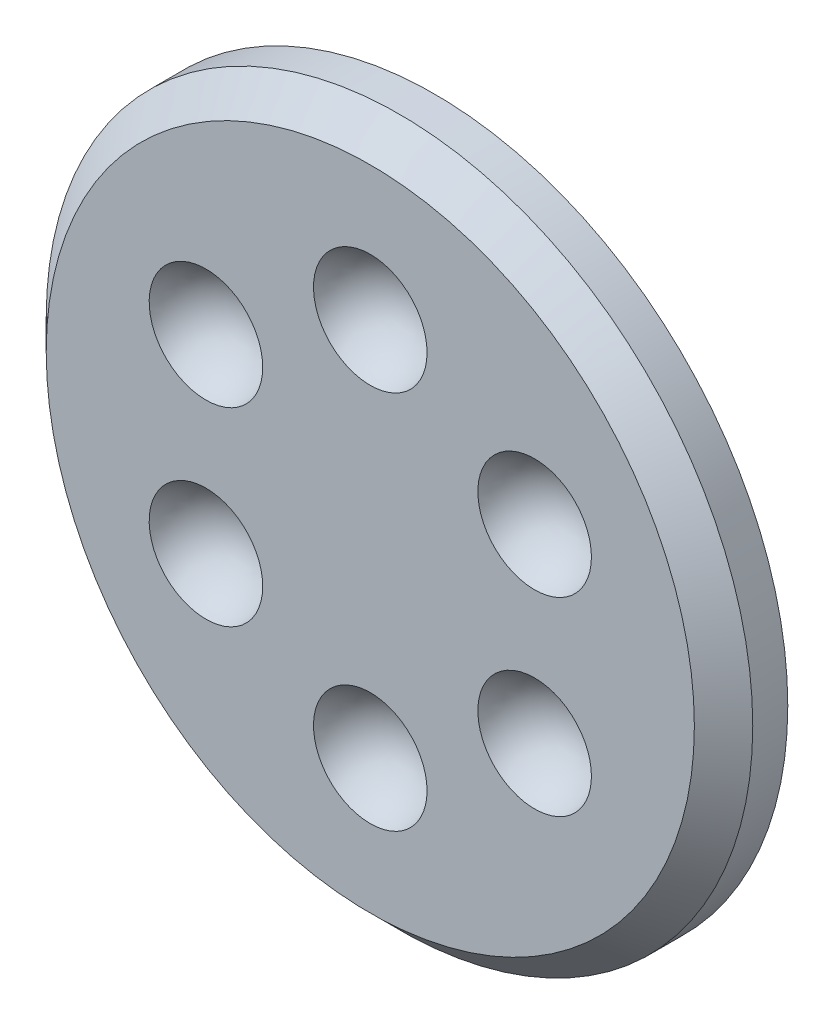
ISO-10303-21;
HEADER;
FILE_DESCRIPTION(('STEP AP214'),'2;1');
FILE_NAME('part.step','',(''),(''),'','','');
FILE_SCHEMA(('AUTOMOTIVE_DESIGN { 1 0 10303 214 1 1 1 1 }'));
ENDSEC;
DATA;
#1=APPLICATION_CONTEXT('core data for automotive mechanical design processes');
#2=APPLICATION_PROTOCOL_DEFINITION('international standard','automotive_design',2000,#1);
#3=PRODUCT_CONTEXT('',#1,'mechanical');
#4=PRODUCT('Part','Part','',(#3));
#5=PRODUCT_RELATED_PRODUCT_CATEGORY('part','',(#4));
#6=PRODUCT_DEFINITION_FORMATION('','',#4);
#7=PRODUCT_DEFINITION_CONTEXT('part definition',#1,'design');
#8=PRODUCT_DEFINITION('design','',#6,#7);
#9=PRODUCT_DEFINITION_SHAPE('','',#8);
#10=(LENGTH_UNIT() NAMED_UNIT(*) SI_UNIT(.MILLI.,.METRE.));
#11=(NAMED_UNIT(*) PLANE_ANGLE_UNIT() SI_UNIT($,.RADIAN.));
#12=(NAMED_UNIT(*) SI_UNIT($,.STERADIAN.) SOLID_ANGLE_UNIT());
#13=UNCERTAINTY_MEASURE_WITH_UNIT(LENGTH_MEASURE(1.E-05),#10,'distance_accuracy_value','');
#14=(GEOMETRIC_REPRESENTATION_CONTEXT(3) GLOBAL_UNCERTAINTY_ASSIGNED_CONTEXT((#13)) GLOBAL_UNIT_ASSIGNED_CONTEXT((#10,
#11,#12)) REPRESENTATION_CONTEXT('',''));
#15=CARTESIAN_POINT('',(0.,0.,0.));
#16=DIRECTION('',(0.,0.,1.));
#17=DIRECTION('',(1.,0.,0.));
#18=AXIS2_PLACEMENT_3D('',#15,#16,#17);
#19=CARTESIAN_POINT('',(0.,0.,2.794));
#20=DIRECTION('',(0.,0.,1.));
#21=DIRECTION('',(1.,0.,0.));
#22=AXIS2_PLACEMENT_3D('',#19,#20,#21);
#23=PLANE('',#22);
#24=CARTESIAN_POINT('',(0.,0.,2.794));
#25=DIRECTION('',(0.,0.,1.));
#26=DIRECTION('',(1.,0.,0.));
#27=AXIS2_PLACEMENT_3D('',#24,#25,#26);
#28=CIRCLE('',#27,14.097);
#29=CARTESIAN_POINT('',(14.097,0.,2.794));
#30=VERTEX_POINT('',#29);
#31=EDGE_CURVE('E37',#30,#30,#28,.T.);
#32=ORIENTED_EDGE('',*,*,#31,.T.);
#33=EDGE_LOOP('',(#32));
#34=FACE_BOUND('',#33,.T.);
#35=CARTESIAN_POINT('',(-7.14903970824058,-4.12749999999993,2.794));
#36=DIRECTION('',(0.,0.,1.));
#37=DIRECTION('',(1.,0.,0.));
#38=AXIS2_PLACEMENT_3D('',#35,#36,#37);
#39=CIRCLE('',#38,2.46956226941132);
#40=CARTESIAN_POINT('',(-4.67947743882926,-4.12749999999993,2.794));
#41=VERTEX_POINT('',#40);
#42=EDGE_CURVE('E51',#41,#41,#39,.F.);
#43=ORIENTED_EDGE('',*,*,#42,.T.);
#44=EDGE_LOOP('',(#43));
#45=FACE_BOUND('',#44,.T.);
#46=CARTESIAN_POINT('',(7.14903970824052,-4.12750000000003,2.794));
#47=DIRECTION('',(0.,0.,1.));
#48=DIRECTION('',(1.,0.,0.));
#49=AXIS2_PLACEMENT_3D('',#46,#47,#48);
#50=CIRCLE('',#49,2.46956226941132);
#51=CARTESIAN_POINT('',(9.61860197765185,-4.12750000000003,2.794));
#52=VERTEX_POINT('',#51);
#53=EDGE_CURVE('E57',#52,#52,#50,.F.);
#54=ORIENTED_EDGE('',*,*,#53,.T.);
#55=EDGE_LOOP('',(#54));
#56=FACE_BOUND('',#55,.T.);
#57=CARTESIAN_POINT('',(0.,8.255,2.794));
#58=DIRECTION('',(0.,0.,1.));
#59=DIRECTION('',(1.,0.,0.));
#60=AXIS2_PLACEMENT_3D('',#57,#58,#59);
#61=CIRCLE('',#60,2.46956226941132);
#62=CARTESIAN_POINT('',(2.46956226941132,8.255,2.794));
#63=VERTEX_POINT('',#62);
#64=EDGE_CURVE('E45',#63,#63,#61,.F.);
#65=ORIENTED_EDGE('',*,*,#64,.T.);
#66=EDGE_LOOP('',(#65));
#67=FACE_BOUND('',#66,.T.);
#68=CARTESIAN_POINT('',(7.14903970824055,4.12749999999998,2.794));
#69=DIRECTION('',(0.,0.,1.));
#70=DIRECTION('',(1.,0.,0.));
#71=AXIS2_PLACEMENT_3D('',#68,#69,#70);
#72=CIRCLE('',#71,2.46956226941132);
#73=CARTESIAN_POINT('',(9.61860197765187,4.12749999999998,2.794));
#74=VERTEX_POINT('',#73);
#75=EDGE_CURVE('E60',#74,#74,#72,.F.);
#76=ORIENTED_EDGE('',*,*,#75,.T.);
#77=EDGE_LOOP('',(#76));
#78=FACE_BOUND('',#77,.T.);
#79=CARTESIAN_POINT('',(0.,-8.255,2.794));
#80=DIRECTION('',(0.,0.,1.));
#81=DIRECTION('',(1.,0.,0.));
#82=AXIS2_PLACEMENT_3D('',#79,#80,#81);
#83=CIRCLE('',#82,2.46956226941132);
#84=CARTESIAN_POINT('',(2.46956226941132,-8.255,2.794));
#85=VERTEX_POINT('',#84);
#86=EDGE_CURVE('E54',#85,#85,#83,.F.);
#87=ORIENTED_EDGE('',*,*,#86,.T.);
#88=EDGE_LOOP('',(#87));
#89=FACE_BOUND('',#88,.T.);
#90=CARTESIAN_POINT('',(-7.14903970824049,4.12750000000008,2.794));
#91=DIRECTION('',(0.,0.,1.));
#92=DIRECTION('',(1.,0.,0.));
#93=AXIS2_PLACEMENT_3D('',#90,#91,#92);
#94=CIRCLE('',#93,2.46956226941132);
#95=CARTESIAN_POINT('',(-4.67947743882917,4.12750000000008,2.794));
#96=VERTEX_POINT('',#95);
#97=EDGE_CURVE('E48',#96,#96,#94,.F.);
#98=ORIENTED_EDGE('',*,*,#97,.T.);
#99=EDGE_LOOP('',(#98));
#100=FACE_BOUND('',#99,.T.);
#101=ADVANCED_FACE('F30',(#34,#45,#56,#67,#78,#89,#100),#23,.T.);
#102=CARTESIAN_POINT('',(0.,0.,2.794));
#103=DIRECTION('',(0.,0.,-1.));
#104=DIRECTION('',(-1.,0.,0.));
#105=AXIS2_PLACEMENT_3D('',#102,#103,#104);
#106=CYLINDRICAL_SURFACE('',#105,15.367);
#107=CARTESIAN_POINT('',(0.,0.,1.524));
#108=DIRECTION('',(0.,0.,1.));
#109=DIRECTION('',(1.,0.,0.));
#110=AXIS2_PLACEMENT_3D('',#107,#108,#109);
#111=CIRCLE('',#110,15.367);
#112=CARTESIAN_POINT('',(15.367,0.,1.524));
#113=VERTEX_POINT('',#112);
#114=EDGE_CURVE('E10',#113,#113,#111,.F.);
#115=ORIENTED_EDGE('',*,*,#114,.T.);
#116=EDGE_LOOP('',(#115));
#117=FACE_BOUND('',#116,.T.);
#118=CARTESIAN_POINT('',(0.,0.,0.));
#119=DIRECTION('',(0.,0.,1.));
#120=DIRECTION('',(1.,0.,0.));
#121=AXIS2_PLACEMENT_3D('',#118,#119,#120);
#122=CIRCLE('',#121,15.367);
#123=CARTESIAN_POINT('',(15.367,0.,0.));
#124=VERTEX_POINT('',#123);
#125=EDGE_CURVE('E41',#124,#124,#122,.T.);
#126=ORIENTED_EDGE('',*,*,#125,.T.);
#127=EDGE_LOOP('',(#126));
#128=FACE_BOUND('',#127,.T.);
#129=ADVANCED_FACE('F80',(#117,#128),#106,.T.);
#130=CARTESIAN_POINT('',(0.,0.,0.));
#131=DIRECTION('',(0.,0.,1.));
#132=DIRECTION('',(1.,0.,0.));
#133=AXIS2_PLACEMENT_3D('',#130,#131,#132);
#134=PLANE('',#133);
#135=ORIENTED_EDGE('',*,*,#125,.F.);
#136=EDGE_LOOP('',(#135));
#137=FACE_BOUND('',#136,.T.);
#138=ADVANCED_FACE('F71',(#137),#134,.F.);
#139=CARTESIAN_POINT('',(0.,8.255,3.556));
#140=DIRECTION('',(0.,0.,1.));
#141=DIRECTION('',(0.,1.,0.));
#142=AXIS2_PLACEMENT_3D('',#139,#140,#141);
#143=SPHERICAL_SURFACE('',#142,2.58445);
#144=ORIENTED_EDGE('',*,*,#64,.F.);
#145=EDGE_LOOP('',(#144));
#146=FACE_BOUND('',#145,.T.);
#147=ADVANCED_FACE('F68',(#146),#143,.F.);
#148=CARTESIAN_POINT('',(7.14903970824055,4.12749999999998,3.556));
#149=DIRECTION('',(0.,0.,1.));
#150=DIRECTION('',(0.86602540378444,0.499999999999998,0.));
#151=AXIS2_PLACEMENT_3D('',#148,#149,#150);
#152=SPHERICAL_SURFACE('',#151,2.58445);
#153=ORIENTED_EDGE('',*,*,#75,.F.);
#154=EDGE_LOOP('',(#153));
#155=FACE_BOUND('',#154,.T.);
#156=ADVANCED_FACE('F70',(#155),#152,.F.);
#157=CARTESIAN_POINT('',(7.14903970824052,-4.12750000000003,3.556));
#158=DIRECTION('',(0.,0.,1.));
#159=DIRECTION('',(0.866025403784436,-0.500000000000004,0.));
#160=AXIS2_PLACEMENT_3D('',#157,#158,#159);
#161=SPHERICAL_SURFACE('',#160,2.58445);
#162=ORIENTED_EDGE('',*,*,#53,.F.);
#163=EDGE_LOOP('',(#162));
#164=FACE_BOUND('',#163,.T.);
#165=ADVANCED_FACE('F77',(#164),#161,.F.);
#166=CARTESIAN_POINT('',(0.,-8.255,3.556));
#167=DIRECTION('',(0.,0.,1.));
#168=DIRECTION('',(0.,-1.,0.));
#169=AXIS2_PLACEMENT_3D('',#166,#167,#168);
#170=SPHERICAL_SURFACE('',#169,2.58445);
#171=ORIENTED_EDGE('',*,*,#86,.F.);
#172=EDGE_LOOP('',(#171));
#173=FACE_BOUND('',#172,.T.);
#174=ADVANCED_FACE('F94',(#173),#170,.F.);
#175=CARTESIAN_POINT('',(-7.14903970824058,-4.12749999999993,3.556));
#176=DIRECTION('',(0.,0.,1.));
#177=DIRECTION('',(-0.866025403784443,-0.499999999999992,0.));
#178=AXIS2_PLACEMENT_3D('',#175,#176,#177);
#179=SPHERICAL_SURFACE('',#178,2.58445);
#180=ORIENTED_EDGE('',*,*,#42,.F.);
#181=EDGE_LOOP('',(#180));
#182=FACE_BOUND('',#181,.T.);
#183=ADVANCED_FACE('F99',(#182),#179,.F.);
#184=CARTESIAN_POINT('',(-7.14903970824049,4.12750000000008,3.556));
#185=DIRECTION('',(0.,0.,1.));
#186=DIRECTION('',(-0.866025403784433,0.50000000000001,0.));
#187=AXIS2_PLACEMENT_3D('',#184,#185,#186);
#188=SPHERICAL_SURFACE('',#187,2.58445);
#189=ORIENTED_EDGE('',*,*,#97,.F.);
#190=EDGE_LOOP('',(#189));
#191=FACE_BOUND('',#190,.T.);
#192=ADVANCED_FACE('F105',(#191),#188,.F.);
#193=CARTESIAN_POINT('',(0.,0.,2.794));
#194=DIRECTION('',(0.,0.,-1.));
#195=DIRECTION('',(-1.,0.,0.));
#196=AXIS2_PLACEMENT_3D('',#193,#194,#195);
#197=CONICAL_SURFACE('',#196,14.097,0.785398163397446);
#198=ORIENTED_EDGE('',*,*,#114,.F.);
#199=EDGE_LOOP('',(#198));
#200=FACE_BOUND('',#199,.T.);
#201=ORIENTED_EDGE('',*,*,#31,.F.);
#202=EDGE_LOOP('',(#201));
#203=FACE_BOUND('',#202,.T.);
#204=ADVANCED_FACE('F32',(#200,#203),#197,.T.);
#205=CLOSED_SHELL('',(#101,#129,#138,#147,#156,#165,#174,#183,#192,#204));
#206=MANIFOLD_SOLID_BREP('B2',#205);
#207=ADVANCED_BREP_SHAPE_REPRESENTATION('',(#18,#206),#14);
#208=SHAPE_DEFINITION_REPRESENTATION(#9,#207);
ENDSEC;
END-ISO-10303-21;
